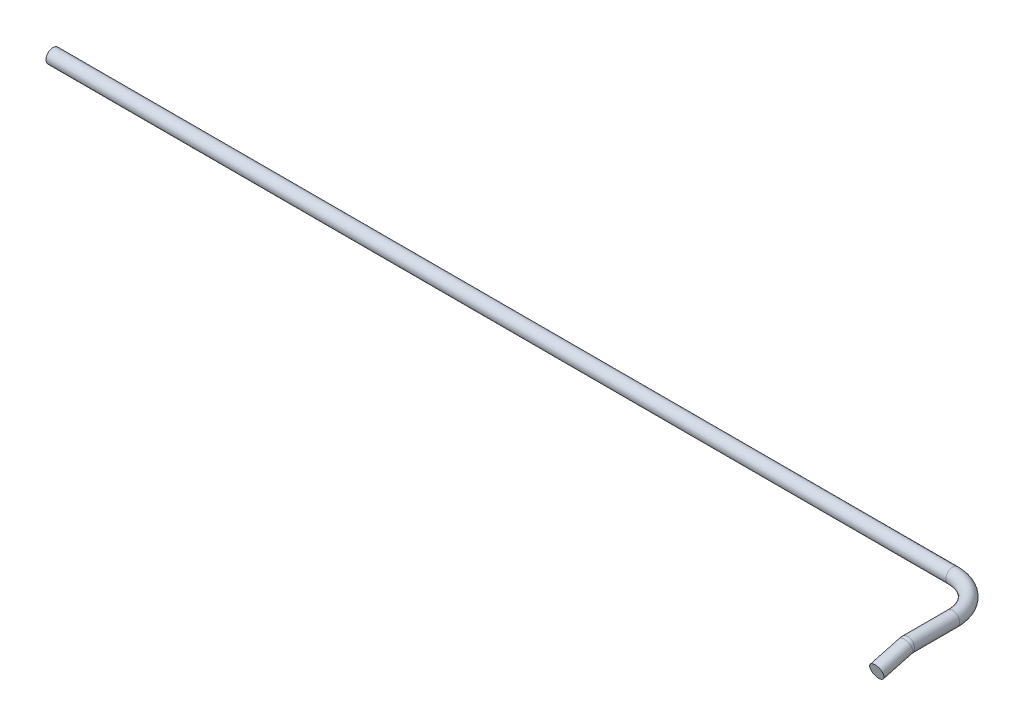
ISO-10303-21;
HEADER;
FILE_DESCRIPTION(('STEP AP214'),'2;1');
FILE_NAME('part.step','',(''),(''),'','','');
FILE_SCHEMA(('AUTOMOTIVE_DESIGN { 1 0 10303 214 1 1 1 1 }'));
ENDSEC;
DATA;
#1=APPLICATION_CONTEXT('core data for automotive mechanical design processes');
#2=APPLICATION_PROTOCOL_DEFINITION('international standard','automotive_design',2000,#1);
#3=PRODUCT_CONTEXT('',#1,'mechanical');
#4=PRODUCT('Part','Part','',(#3));
#5=PRODUCT_RELATED_PRODUCT_CATEGORY('part','',(#4));
#6=PRODUCT_DEFINITION_FORMATION('','',#4);
#7=PRODUCT_DEFINITION_CONTEXT('part definition',#1,'design');
#8=PRODUCT_DEFINITION('design','',#6,#7);
#9=PRODUCT_DEFINITION_SHAPE('','',#8);
#10=(LENGTH_UNIT() NAMED_UNIT(*) SI_UNIT(.MILLI.,.METRE.));
#11=(NAMED_UNIT(*) PLANE_ANGLE_UNIT() SI_UNIT($,.RADIAN.));
#12=(NAMED_UNIT(*) SI_UNIT($,.STERADIAN.) SOLID_ANGLE_UNIT());
#13=UNCERTAINTY_MEASURE_WITH_UNIT(LENGTH_MEASURE(1.E-05),#10,'distance_accuracy_value','');
#14=(GEOMETRIC_REPRESENTATION_CONTEXT(3) GLOBAL_UNCERTAINTY_ASSIGNED_CONTEXT((#13)) GLOBAL_UNIT_ASSIGNED_CONTEXT((#10,
#11,#12)) REPRESENTATION_CONTEXT('',''));
#15=CARTESIAN_POINT('',(0.,0.,0.));
#16=DIRECTION('',(0.,0.,1.));
#17=DIRECTION('',(1.,0.,0.));
#18=AXIS2_PLACEMENT_3D('',#15,#16,#17);
#19=CARTESIAN_POINT('',(0.,0.,-7.62));
#20=DIRECTION('',(0.,0.,1.));
#21=DIRECTION('',(1.,0.,0.));
#22=AXIS2_PLACEMENT_3D('',#19,#20,#21);
#23=CYLINDRICAL_SURFACE('',#22,1.1811);
#24=CARTESIAN_POINT('',(0.,0.,-7.62));
#25=DIRECTION('',(0.,0.,-1.));
#26=DIRECTION('',(-1.,0.,0.));
#27=AXIS2_PLACEMENT_3D('',#24,#25,#26);
#28=CIRCLE('',#27,1.1811);
#29=CARTESIAN_POINT('',(1.1811,0.,-7.62));
#30=VERTEX_POINT('',#29);
#31=EDGE_CURVE('E41',#30,#30,#28,.T.);
#32=ORIENTED_EDGE('',*,*,#31,.F.);
#33=EDGE_LOOP('',(#32));
#34=FACE_BOUND('',#33,.T.);
#35=CARTESIAN_POINT('',(0.,0.,0.));
#36=DIRECTION('',(0.,0.,1.));
#37=DIRECTION('',(1.,0.,0.));
#38=AXIS2_PLACEMENT_3D('',#35,#36,#37);
#39=CIRCLE('',#38,1.1811);
#40=CARTESIAN_POINT('',(0.,1.1811,0.));
#41=VERTEX_POINT('',#40);
#42=EDGE_CURVE('E10',#41,#41,#39,.T.);
#43=ORIENTED_EDGE('',*,*,#42,.F.);
#44=EDGE_LOOP('',(#43));
#45=FACE_BOUND('',#44,.T.);
#46=ADVANCED_FACE('F31',(#34,#45),#23,.T.);
#47=CARTESIAN_POINT('',(-6.35,0.,-7.62));
#48=DIRECTION('',(0.,-1.,0.));
#49=DIRECTION('',(0.,0.,-1.));
#50=AXIS2_PLACEMENT_3D('',#47,#48,#49);
#51=TOROIDAL_SURFACE('',#50,6.35,1.1811);
#52=CARTESIAN_POINT('',(-6.35000000000002,0.,-13.97));
#53=DIRECTION('',(-1.,0.,0.));
#54=DIRECTION('',(0.,0.,1.));
#55=AXIS2_PLACEMENT_3D('',#52,#53,#54);
#56=CIRCLE('',#55,1.1811);
#57=CARTESIAN_POINT('',(-6.35000000000003,0.,-15.1511));
#58=VERTEX_POINT('',#57);
#59=EDGE_CURVE('E37',#58,#58,#56,.T.);
#60=CARTESIAN_POINT('',(-6.35,0.,-7.62));
#61=DIRECTION('',(0.,-1.,0.));
#62=DIRECTION('',(0.,0.,-1.));
#63=AXIS2_PLACEMENT_3D('',#60,#61,#62);
#64=CIRCLE('',#63,7.5311);
#65=EDGE_CURVE('',#58,#30,#64,.T.);
#66=ORIENTED_EDGE('',*,*,#59,.F.);
#67=ORIENTED_EDGE('',*,*,#31,.T.);
#68=ORIENTED_EDGE('',*,*,#65,.T.);
#69=ORIENTED_EDGE('',*,*,#65,.F.);
#70=EDGE_LOOP('',(#66,#68,#67,#69));
#71=FACE_BOUND('',#70,.T.);
#72=ADVANCED_FACE('F76',(#71),#51,.T.);
#73=CARTESIAN_POINT('',(-158.75,0.,-13.9699999999995));
#74=DIRECTION('',(1.,0.,0.));
#75=DIRECTION('',(0.,0.,-1.));
#76=AXIS2_PLACEMENT_3D('',#73,#74,#75);
#77=CYLINDRICAL_SURFACE('',#76,1.1811);
#78=CARTESIAN_POINT('',(-158.75,0.,-13.9699999999995));
#79=DIRECTION('',(-1.,0.,0.));
#80=DIRECTION('',(0.,0.,1.));
#81=AXIS2_PLACEMENT_3D('',#78,#79,#80);
#82=CIRCLE('',#81,1.1811);
#83=CARTESIAN_POINT('',(-158.75,0.,-15.1510999999995));
#84=VERTEX_POINT('',#83);
#85=EDGE_CURVE('E45',#84,#84,#82,.T.);
#86=CARTESIAN_POINT('',(-158.75,0.,-15.1510999999995));
#87=CARTESIAN_POINT('',(-157.1625,0.,-15.1510999999995));
#88=CARTESIAN_POINT('',(-155.575,0.,-15.1510999999995));
#89=CARTESIAN_POINT('',(-152.4,0.,-15.1510999999995));
#90=CARTESIAN_POINT('',(-150.8125,0.,-15.1510999999995));
#91=CARTESIAN_POINT('',(-147.6375,0.,-15.1510999999995));
#92=CARTESIAN_POINT('',(-146.05,0.,-15.1510999999995));
#93=CARTESIAN_POINT('',(-142.875,0.,-15.1510999999995));
#94=CARTESIAN_POINT('',(-141.2875,0.,-15.1510999999995));
#95=CARTESIAN_POINT('',(-138.1125,0.,-15.1510999999995));
#96=CARTESIAN_POINT('',(-136.525,0.,-15.1510999999995));
#97=CARTESIAN_POINT('',(-133.35,0.,-15.1510999999996));
#98=CARTESIAN_POINT('',(-131.7625,0.,-15.1510999999996));
#99=CARTESIAN_POINT('',(-128.5875,0.,-15.1510999999996));
#100=CARTESIAN_POINT('',(-127.,0.,-15.1510999999996));
#101=CARTESIAN_POINT('',(-123.825,0.,-15.1510999999996));
#102=CARTESIAN_POINT('',(-122.2375,0.,-15.1510999999996));
#103=CARTESIAN_POINT('',(-119.0625,0.,-15.1510999999996));
#104=CARTESIAN_POINT('',(-117.475,0.,-15.1510999999996));
#105=CARTESIAN_POINT('',(-114.3,0.,-15.1510999999996));
#106=CARTESIAN_POINT('',(-112.7125,0.,-15.1510999999996));
#107=CARTESIAN_POINT('',(-109.5375,0.,-15.1510999999996));
#108=CARTESIAN_POINT('',(-107.95,0.,-15.1510999999996));
#109=CARTESIAN_POINT('',(-104.775,0.,-15.1510999999997));
#110=CARTESIAN_POINT('',(-103.1875,0.,-15.1510999999997));
#111=CARTESIAN_POINT('',(-100.0125,0.,-15.1510999999997));
#112=CARTESIAN_POINT('',(-98.425,0.,-15.1510999999997));
#113=CARTESIAN_POINT('',(-95.25,0.,-15.1510999999997));
#114=CARTESIAN_POINT('',(-93.6625,0.,-15.1510999999997));
#115=CARTESIAN_POINT('',(-90.4875,0.,-15.1510999999997));
#116=CARTESIAN_POINT('',(-88.9,0.,-15.1510999999997));
#117=CARTESIAN_POINT('',(-85.725,0.,-15.1510999999997));
#118=CARTESIAN_POINT('',(-84.1375,0.,-15.1510999999997));
#119=CARTESIAN_POINT('',(-80.9625,0.,-15.1510999999997));
#120=CARTESIAN_POINT('',(-79.375,0.,-15.1510999999997));
#121=CARTESIAN_POINT('',(-76.2,0.,-15.1510999999998));
#122=CARTESIAN_POINT('',(-74.6125,0.,-15.1510999999998));
#123=CARTESIAN_POINT('',(-71.4375,0.,-15.1510999999998));
#124=CARTESIAN_POINT('',(-69.85,0.,-15.1510999999998));
#125=CARTESIAN_POINT('',(-66.675,0.,-15.1510999999998));
#126=CARTESIAN_POINT('',(-65.0875,0.,-15.1510999999998));
#127=CARTESIAN_POINT('',(-61.9125,0.,-15.1510999999998));
#128=CARTESIAN_POINT('',(-60.325,0.,-15.1510999999998));
#129=CARTESIAN_POINT('',(-57.15,0.,-15.1510999999998));
#130=CARTESIAN_POINT('',(-55.5625,0.,-15.1510999999998));
#131=CARTESIAN_POINT('',(-52.3875,0.,-15.1510999999998));
#132=CARTESIAN_POINT('',(-50.8,0.,-15.1510999999998));
#133=CARTESIAN_POINT('',(-47.625,0.,-15.1510999999999));
#134=CARTESIAN_POINT('',(-46.0375,0.,-15.1510999999999));
#135=CARTESIAN_POINT('',(-42.8625,0.,-15.1510999999999));
#136=CARTESIAN_POINT('',(-41.275,0.,-15.1510999999999));
#137=CARTESIAN_POINT('',(-38.1,0.,-15.1510999999999));
#138=CARTESIAN_POINT('',(-36.5125,0.,-15.1510999999999));
#139=CARTESIAN_POINT('',(-33.3375,0.,-15.1510999999999));
#140=CARTESIAN_POINT('',(-31.75,0.,-15.1510999999999));
#141=CARTESIAN_POINT('',(-28.575,0.,-15.1510999999999));
#142=CARTESIAN_POINT('',(-26.9875,0.,-15.1510999999999));
#143=CARTESIAN_POINT('',(-23.8125,0.,-15.1510999999999));
#144=CARTESIAN_POINT('',(-22.225,0.,-15.1510999999999));
#145=CARTESIAN_POINT('',(-19.05,0.,-15.1511));
#146=CARTESIAN_POINT('',(-17.4625,0.,-15.1511));
#147=CARTESIAN_POINT('',(-14.2875,0.,-15.1511));
#148=CARTESIAN_POINT('',(-12.7,0.,-15.1511));
#149=CARTESIAN_POINT('',(-9.52500000000003,0.,-15.1511));
#150=CARTESIAN_POINT('',(-7.93750000000002,0.,-15.1511));
#151=CARTESIAN_POINT('',(-6.35000000000002,0.,-15.1511));
#152=B_SPLINE_CURVE_WITH_KNOTS('',3,(#86,#87,#88,#89,#90,#91,#92,#93,#94,#95,#96,#97,#98,#99,
#100,#101,#102,#103,#104,#105,#106,#107,#108,#109,#110,#111,#112,#113,#114,#115,#116,#117,#118,
#119,#120,#121,#122,#123,#124,#125,#126,#127,#128,#129,#130,#131,#132,#133,#134,#135,#136,#137,
#138,#139,#140,#141,#142,#143,#144,#145,#146,#147,#148,#149,#150,#151),.UNSPECIFIED.,.F.,.F.,(4,
2,2,2,2,2,2,2,2,2,2,2,2,2,2,2,2,2,2,2,2,2,2,2,2,2,2,2,2,2,2,2,4),(0.,4.76249999999998,
9.52499999999998,14.2875,19.05,23.8125,28.575,33.3375,38.1,42.8625,47.625,52.3875,57.15,61.9125,
66.675,71.4375,76.2,80.9625,85.725,90.4875,95.25,100.0125,104.775,109.5375,114.3,119.0625,
123.825,128.5875,133.35,138.1125,142.875,147.6375,152.4),.UNSPECIFIED.);
#153=EDGE_CURVE('BSEAM72',#84,#58,#152,.T.);
#154=ORIENTED_EDGE('',*,*,#85,.F.);
#155=ORIENTED_EDGE('',*,*,#59,.T.);
#156=ORIENTED_EDGE('',*,*,#153,.T.);
#157=ORIENTED_EDGE('',*,*,#153,.F.);
#158=EDGE_LOOP('',(#154,#156,#155,#157));
#159=FACE_BOUND('',#158,.T.);
#160=ADVANCED_FACE('F72',(#159),#77,.T.);
#161=CARTESIAN_POINT('',(-158.75,0.,-13.9699999999995));
#162=DIRECTION('',(-1.,0.,0.));
#163=DIRECTION('',(0.,0.,1.));
#164=AXIS2_PLACEMENT_3D('',#161,#162,#163);
#165=PLANE('',#164);
#166=ORIENTED_EDGE('',*,*,#85,.T.);
#167=EDGE_LOOP('',(#166));
#168=FACE_BOUND('',#167,.T.);
#169=ADVANCED_FACE('F67',(#168),#165,.T.);
#170=CARTESIAN_POINT('',(0.,-1.27,0.));
#171=DIRECTION('',(-1.,0.,0.));
#172=DIRECTION('',(0.,0.,1.));
#173=AXIS2_PLACEMENT_3D('',#170,#171,#172);
#174=TOROIDAL_SURFACE('',#173,1.27,1.1811);
#175=CARTESIAN_POINT('',(0.,-0.0432742006128835,0.328700187280202));
#176=DIRECTION('',(0.,-0.258819045102521,0.965925826289068));
#177=DIRECTION('',(1.,0.,0.));
#178=AXIS2_PLACEMENT_3D('',#175,#176,#177);
#179=CIRCLE('',#178,1.1811);
#180=CARTESIAN_POINT('',(0.,1.09758079281714,0.63439136145079));
#181=VERTEX_POINT('',#180);
#182=EDGE_CURVE('E50',#181,#181,#179,.T.);
#183=CARTESIAN_POINT('',(0.,-1.27,0.));
#184=DIRECTION('',(-1.,0.,0.));
#185=DIRECTION('',(0.,0.,1.));
#186=AXIS2_PLACEMENT_3D('',#183,#184,#185);
#187=CIRCLE('',#186,2.4511);
#188=EDGE_CURVE('',#181,#41,#187,.T.);
#189=ORIENTED_EDGE('',*,*,#182,.F.);
#190=ORIENTED_EDGE('',*,*,#42,.T.);
#191=ORIENTED_EDGE('',*,*,#188,.T.);
#192=ORIENTED_EDGE('',*,*,#188,.F.);
#193=EDGE_LOOP('',(#189,#191,#190,#192));
#194=FACE_BOUND('',#193,.T.);
#195=ADVANCED_FACE('F62',(#194),#174,.T.);
#196=CARTESIAN_POINT('',(0.,-1.35807494973369,5.23560338482867));
#197=DIRECTION('',(0.,0.258819045102521,-0.965925826289068));
#198=DIRECTION('',(0.,0.965925826289068,0.258819045102521));
#199=AXIS2_PLACEMENT_3D('',#196,#197,#198);
#200=CYLINDRICAL_SURFACE('',#199,1.1811);
#201=CARTESIAN_POINT('',(0.,-1.35807494973369,5.23560338482867));
#202=DIRECTION('',(0.,-0.258819045102521,0.965925826289068));
#203=DIRECTION('',(0.,-0.965925826289068,-0.258819045102521));
#204=AXIS2_PLACEMENT_3D('',#201,#202,#203);
#205=CIRCLE('',#204,1.1811);
#206=CARTESIAN_POINT('',(0.,-2.49892994316371,4.92991221065808));
#207=VERTEX_POINT('',#206);
#208=EDGE_CURVE('E53',#207,#207,#205,.T.);
#209=ORIENTED_EDGE('',*,*,#208,.F.);
#210=EDGE_LOOP('',(#209));
#211=FACE_BOUND('',#210,.T.);
#212=ORIENTED_EDGE('',*,*,#182,.T.);
#213=EDGE_LOOP('',(#212));
#214=FACE_BOUND('',#213,.T.);
#215=ADVANCED_FACE('F59',(#211,#214),#200,.T.);
#216=CARTESIAN_POINT('',(0.,-1.35807494973369,5.23560338482867));
#217=DIRECTION('',(0.,-0.258819045102521,0.965925826289068));
#218=DIRECTION('',(0.,-0.965925826289068,-0.258819045102521));
#219=AXIS2_PLACEMENT_3D('',#216,#217,#218);
#220=PLANE('',#219);
#221=ORIENTED_EDGE('',*,*,#208,.T.);
#222=EDGE_LOOP('',(#221));
#223=FACE_BOUND('',#222,.T.);
#224=ADVANCED_FACE('F57',(#223),#220,.T.);
#225=CLOSED_SHELL('',(#46,#72,#160,#169,#195,#215,#224));
#226=MANIFOLD_SOLID_BREP('B2',#225);
#227=ADVANCED_BREP_SHAPE_REPRESENTATION('',(#18,#226),#14);
#228=SHAPE_DEFINITION_REPRESENTATION(#9,#227);
ENDSEC;
END-ISO-10303-21;
